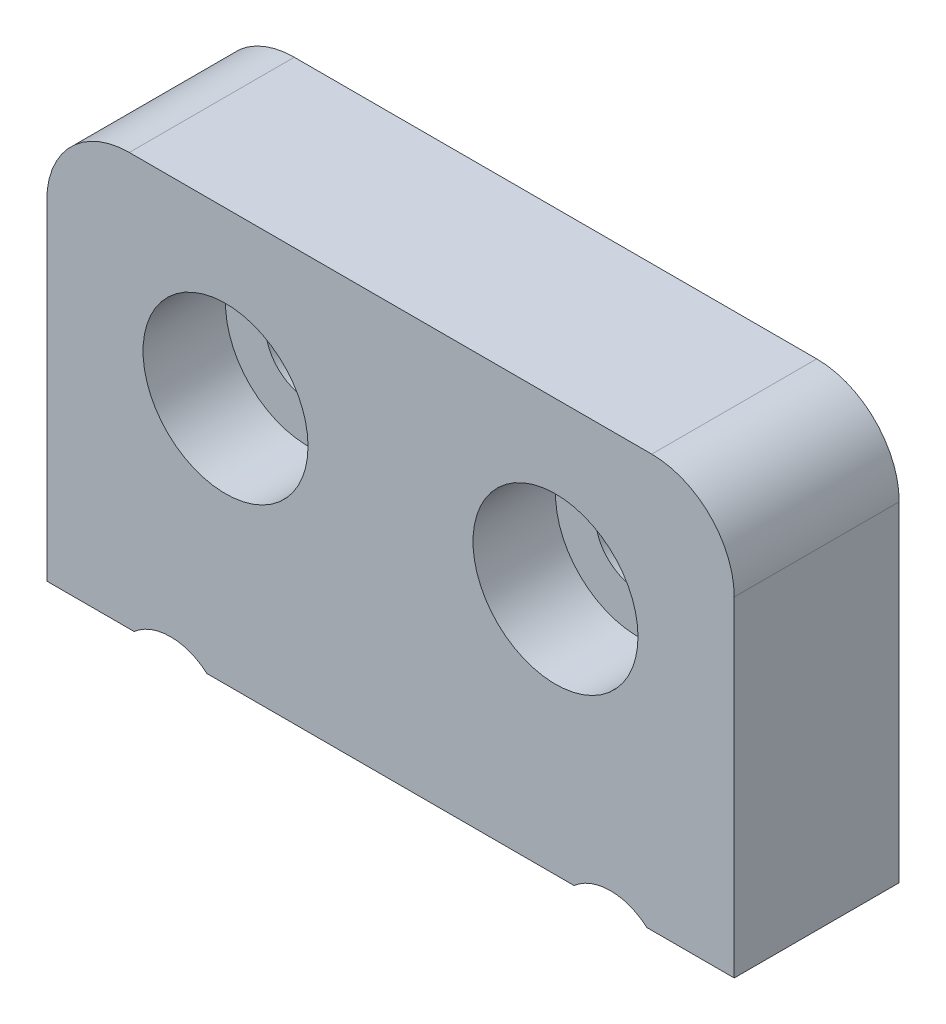
ISO-10303-21;
HEADER;
FILE_DESCRIPTION(('STEP AP214'),'2;1');
FILE_NAME('part.step','',(''),(''),'','','');
FILE_SCHEMA(('AUTOMOTIVE_DESIGN { 1 0 10303 214 1 1 1 1 }'));
ENDSEC;
DATA;
#1=APPLICATION_CONTEXT('core data for automotive mechanical design processes');
#2=APPLICATION_PROTOCOL_DEFINITION('international standard','automotive_design',2000,#1);
#3=PRODUCT_CONTEXT('',#1,'mechanical');
#4=PRODUCT('Part','Part','',(#3));
#5=PRODUCT_RELATED_PRODUCT_CATEGORY('part','',(#4));
#6=PRODUCT_DEFINITION_FORMATION('','',#4);
#7=PRODUCT_DEFINITION_CONTEXT('part definition',#1,'design');
#8=PRODUCT_DEFINITION('design','',#6,#7);
#9=PRODUCT_DEFINITION_SHAPE('','',#8);
#10=(LENGTH_UNIT() NAMED_UNIT(*) SI_UNIT(.MILLI.,.METRE.));
#11=(NAMED_UNIT(*) PLANE_ANGLE_UNIT() SI_UNIT($,.RADIAN.));
#12=(NAMED_UNIT(*) SI_UNIT($,.STERADIAN.) SOLID_ANGLE_UNIT());
#13=UNCERTAINTY_MEASURE_WITH_UNIT(LENGTH_MEASURE(1.E-05),#10,'distance_accuracy_value','');
#14=(GEOMETRIC_REPRESENTATION_CONTEXT(3) GLOBAL_UNCERTAINTY_ASSIGNED_CONTEXT((#13)) GLOBAL_UNIT_ASSIGNED_CONTEXT((#10,
#11,#12)) REPRESENTATION_CONTEXT('',''));
#15=CARTESIAN_POINT('',(0.,0.,0.));
#16=DIRECTION('',(0.,0.,1.));
#17=DIRECTION('',(1.,0.,0.));
#18=AXIS2_PLACEMENT_3D('',#15,#16,#17);
#19=CARTESIAN_POINT('',(6.5,9.,6.));
#20=DIRECTION('',(0.,0.,-1.));
#21=DIRECTION('',(-1.,0.,0.));
#22=AXIS2_PLACEMENT_3D('',#19,#20,#21);
#23=CYLINDRICAL_SURFACE('',#22,1.55);
#24=CARTESIAN_POINT('',(6.5,9.,0.));
#25=DIRECTION('',(0.,0.,1.));
#26=DIRECTION('',(1.,0.,0.));
#27=AXIS2_PLACEMENT_3D('',#24,#25,#26);
#28=CIRCLE('',#27,1.55);
#29=CARTESIAN_POINT('',(8.05,9.,0.));
#30=VERTEX_POINT('',#29);
#31=EDGE_CURVE('E194',#30,#30,#28,.T.);
#32=ORIENTED_EDGE('',*,*,#31,.F.);
#33=EDGE_LOOP('',(#32));
#34=FACE_BOUND('',#33,.T.);
#35=CARTESIAN_POINT('',(6.5,9.,3.));
#36=DIRECTION('',(0.,0.,1.));
#37=DIRECTION('',(1.,0.,0.));
#38=AXIS2_PLACEMENT_3D('',#35,#36,#37);
#39=CIRCLE('',#38,1.55);
#40=CARTESIAN_POINT('',(8.05,9.,3.));
#41=VERTEX_POINT('',#40);
#42=EDGE_CURVE('E43',#41,#41,#39,.T.);
#43=ORIENTED_EDGE('',*,*,#42,.T.);
#44=EDGE_LOOP('',(#43));
#45=FACE_BOUND('',#44,.T.);
#46=ADVANCED_FACE('F39',(#34,#45),#23,.F.);
#47=CARTESIAN_POINT('',(18.5,9.,6.));
#48=DIRECTION('',(0.,0.,-1.));
#49=DIRECTION('',(-1.,0.,0.));
#50=AXIS2_PLACEMENT_3D('',#47,#48,#49);
#51=CYLINDRICAL_SURFACE('',#50,1.55);
#52=CARTESIAN_POINT('',(18.5,9.,0.));
#53=DIRECTION('',(0.,0.,1.));
#54=DIRECTION('',(-1.,0.,0.));
#55=AXIS2_PLACEMENT_3D('',#52,#53,#54);
#56=CIRCLE('',#55,1.55);
#57=CARTESIAN_POINT('',(16.95,9.,0.));
#58=VERTEX_POINT('',#57);
#59=EDGE_CURVE('E199',#58,#58,#56,.T.);
#60=ORIENTED_EDGE('',*,*,#59,.F.);
#61=EDGE_LOOP('',(#60));
#62=FACE_BOUND('',#61,.T.);
#63=CARTESIAN_POINT('',(18.5,9.,3.));
#64=DIRECTION('',(0.,0.,1.));
#65=DIRECTION('',(1.,0.,0.));
#66=AXIS2_PLACEMENT_3D('',#63,#64,#65);
#67=CIRCLE('',#66,1.55);
#68=CARTESIAN_POINT('',(20.05,9.,3.));
#69=VERTEX_POINT('',#68);
#70=EDGE_CURVE('E274',#69,#69,#67,.T.);
#71=ORIENTED_EDGE('',*,*,#70,.T.);
#72=EDGE_LOOP('',(#71));
#73=FACE_BOUND('',#72,.T.);
#74=ADVANCED_FACE('F391',(#62,#73),#51,.F.);
#75=CARTESIAN_POINT('',(0.,0.,6.));
#76=DIRECTION('',(0.,1.,0.));
#77=DIRECTION('',(0.,0.,1.));
#78=AXIS2_PLACEMENT_3D('',#75,#76,#77);
#79=PLANE('',#78);
#80=DIRECTION('',(1.,0.,0.));
#81=VECTOR('',#80,1.);
#82=CARTESIAN_POINT('',(0.,0.,0.));
#83=LINE('',#82,#81);
#84=CARTESIAN_POINT('',(0.,0.,0.));
#85=VERTEX_POINT('',#84);
#86=CARTESIAN_POINT('',(3.17712434446771,0.,0.));
#87=VERTEX_POINT('',#86);
#88=EDGE_CURVE('E165',#85,#87,#83,.T.);
#89=ORIENTED_EDGE('',*,*,#88,.T.);
#90=DIRECTION('',(0.,0.,1.));
#91=VECTOR('',#90,1.);
#92=CARTESIAN_POINT('',(3.17712434446771,0.,0.));
#93=LINE('',#92,#91);
#94=CARTESIAN_POINT('',(3.17712434446771,0.,2.29289321881345));
#95=VERTEX_POINT('',#94);
#96=EDGE_CURVE('E144',#87,#95,#93,.T.);
#97=ORIENTED_EDGE('',*,*,#96,.T.);
#98=CARTESIAN_POINT('',(4.5,0.,3.));
#99=DIRECTION('',(0.,-1.,0.));
#100=DIRECTION('',(0.,0.,-1.));
#101=AXIS2_PLACEMENT_3D('',#98,#99,#100);
#102=CIRCLE('',#101,1.5);
#103=CARTESIAN_POINT('',(3.17712434446771,0.,3.70710678118655));
#104=VERTEX_POINT('',#103);
#105=EDGE_CURVE('E231',#104,#95,#102,.T.);
#106=ORIENTED_EDGE('',*,*,#105,.F.);
#107=CARTESIAN_POINT('',(3.17712434446771,0.,6.));
#108=VERTEX_POINT('',#107);
#109=EDGE_CURVE('E157',#104,#108,#93,.T.);
#110=ORIENTED_EDGE('',*,*,#109,.T.);
#111=DIRECTION('',(1.,0.,0.));
#112=VECTOR('',#111,1.);
#113=CARTESIAN_POINT('',(0.,0.,6.));
#114=LINE('',#113,#112);
#115=CARTESIAN_POINT('',(0.,0.,6.));
#116=VERTEX_POINT('',#115);
#117=EDGE_CURVE('E209',#116,#108,#114,.T.);
#118=ORIENTED_EDGE('',*,*,#117,.F.);
#119=DIRECTION('',(0.,0.,-1.));
#120=VECTOR('',#119,1.);
#121=CARTESIAN_POINT('',(0.,0.,6.));
#122=LINE('',#121,#120);
#123=EDGE_CURVE('E176',#116,#85,#122,.T.);
#124=ORIENTED_EDGE('',*,*,#123,.T.);
#125=EDGE_LOOP('',(#89,#97,#106,#110,#118,#124));
#126=FACE_BOUND('',#125,.T.);
#127=ADVANCED_FACE('F173',(#126),#79,.F.);
#128=CARTESIAN_POINT('',(5.8228756555323,0.,6.));
#129=VERTEX_POINT('',#128);
#130=CARTESIAN_POINT('',(19.1771243444677,0.,6.));
#131=VERTEX_POINT('',#130);
#132=EDGE_CURVE('E213',#129,#131,#114,.T.);
#133=ORIENTED_EDGE('',*,*,#132,.F.);
#134=DIRECTION('',(0.,0.,1.));
#135=VECTOR('',#134,1.);
#136=CARTESIAN_POINT('',(5.8228756555323,0.,0.));
#137=LINE('',#136,#135);
#138=CARTESIAN_POINT('',(5.8228756555323,0.,3.70710678118655));
#139=VERTEX_POINT('',#138);
#140=EDGE_CURVE('E156',#139,#129,#137,.T.);
#141=ORIENTED_EDGE('',*,*,#140,.F.);
#142=CARTESIAN_POINT('',(5.8228756555323,0.,2.29289321881345));
#143=VERTEX_POINT('',#142);
#144=EDGE_CURVE('E232',#143,#139,#102,.T.);
#145=ORIENTED_EDGE('',*,*,#144,.F.);
#146=CARTESIAN_POINT('',(5.8228756555323,0.,0.));
#147=VERTEX_POINT('',#146);
#148=EDGE_CURVE('E254',#147,#143,#137,.T.);
#149=ORIENTED_EDGE('',*,*,#148,.F.);
#150=CARTESIAN_POINT('',(19.1771243444677,0.,0.));
#151=VERTEX_POINT('',#150);
#152=EDGE_CURVE('E169',#147,#151,#83,.T.);
#153=ORIENTED_EDGE('',*,*,#152,.T.);
#154=DIRECTION('',(0.,0.,1.));
#155=VECTOR('',#154,1.);
#156=CARTESIAN_POINT('',(19.1771243444677,0.,0.));
#157=LINE('',#156,#155);
#158=CARTESIAN_POINT('',(19.1771243444677,0.,2.29289321881345));
#159=VERTEX_POINT('',#158);
#160=EDGE_CURVE('E239',#151,#159,#157,.T.);
#161=ORIENTED_EDGE('',*,*,#160,.T.);
#162=CARTESIAN_POINT('',(20.5,0.,3.));
#163=DIRECTION('',(0.,-1.,0.));
#164=DIRECTION('',(0.,0.,1.));
#165=AXIS2_PLACEMENT_3D('',#162,#163,#164);
#166=CIRCLE('',#165,1.5);
#167=CARTESIAN_POINT('',(19.1771243444677,0.,3.70710678118655));
#168=VERTEX_POINT('',#167);
#169=EDGE_CURVE('E222',#168,#159,#166,.T.);
#170=ORIENTED_EDGE('',*,*,#169,.F.);
#171=EDGE_CURVE('E244',#168,#131,#157,.T.);
#172=ORIENTED_EDGE('',*,*,#171,.T.);
#173=EDGE_LOOP('',(#133,#141,#145,#149,#153,#161,#170,#172));
#174=FACE_BOUND('',#173,.T.);
#175=ADVANCED_FACE('F388',(#174),#79,.F.);
#176=CARTESIAN_POINT('',(0.,0.,6.));
#177=DIRECTION('',(0.,0.,-1.));
#178=DIRECTION('',(-1.,0.,0.));
#179=AXIS2_PLACEMENT_3D('',#176,#177,#178);
#180=PLANE('',#179);
#181=CARTESIAN_POINT('',(6.5,9.,6.));
#182=DIRECTION('',(0.,0.,1.));
#183=DIRECTION('',(1.,0.,0.));
#184=AXIS2_PLACEMENT_3D('',#181,#182,#183);
#185=CIRCLE('',#184,3.);
#186=CARTESIAN_POINT('',(9.5,9.,6.));
#187=VERTEX_POINT('',#186);
#188=EDGE_CURVE('E267',#187,#187,#185,.T.);
#189=ORIENTED_EDGE('',*,*,#188,.F.);
#190=EDGE_LOOP('',(#189));
#191=FACE_BOUND('',#190,.T.);
#192=CARTESIAN_POINT('',(18.5,9.,6.));
#193=DIRECTION('',(0.,0.,1.));
#194=DIRECTION('',(1.,0.,0.));
#195=AXIS2_PLACEMENT_3D('',#192,#193,#194);
#196=CIRCLE('',#195,3.);
#197=CARTESIAN_POINT('',(21.5,9.,6.));
#198=VERTEX_POINT('',#197);
#199=EDGE_CURVE('E259',#198,#198,#196,.T.);
#200=ORIENTED_EDGE('',*,*,#199,.F.);
#201=EDGE_LOOP('',(#200));
#202=FACE_BOUND('',#201,.T.);
#203=DIRECTION('',(-1.,0.,0.));
#204=VECTOR('',#203,1.);
#205=CARTESIAN_POINT('',(0.,15.,6.));
#206=LINE('',#205,#204);
#207=CARTESIAN_POINT('',(22.,15.,6.));
#208=VERTEX_POINT('',#207);
#209=CARTESIAN_POINT('',(3.,15.,6.));
#210=VERTEX_POINT('',#209);
#211=EDGE_CURVE('E202',#208,#210,#206,.T.);
#212=ORIENTED_EDGE('',*,*,#211,.T.);
#213=CARTESIAN_POINT('',(3.,12.,6.));
#214=DIRECTION('',(0.,0.,-1.));
#215=DIRECTION('',(-1.,0.,0.));
#216=AXIS2_PLACEMENT_3D('',#213,#214,#215);
#217=CIRCLE('',#216,3.);
#218=CARTESIAN_POINT('',(0.,12.,6.));
#219=VERTEX_POINT('',#218);
#220=EDGE_CURVE('E49',#210,#219,#217,.F.);
#221=ORIENTED_EDGE('',*,*,#220,.T.);
#222=DIRECTION('',(0.,-1.,0.));
#223=VECTOR('',#222,1.);
#224=CARTESIAN_POINT('',(0.,0.,6.));
#225=LINE('',#224,#223);
#226=EDGE_CURVE('E215',#219,#116,#225,.T.);
#227=ORIENTED_EDGE('',*,*,#226,.T.);
#228=ORIENTED_EDGE('',*,*,#117,.T.);
#229=CARTESIAN_POINT('',(4.5,-1.5,6.));
#230=DIRECTION('',(0.,0.,1.));
#231=DIRECTION('',(-1.,0.,0.));
#232=AXIS2_PLACEMENT_3D('',#229,#230,#231);
#233=CIRCLE('',#232,2.);
#234=EDGE_CURVE('E171',#129,#108,#233,.T.);
#235=ORIENTED_EDGE('',*,*,#234,.F.);
#236=ORIENTED_EDGE('',*,*,#132,.T.);
#237=CARTESIAN_POINT('',(20.5,-1.49999999999999,6.));
#238=DIRECTION('',(0.,0.,1.));
#239=DIRECTION('',(1.,0.,0.));
#240=AXIS2_PLACEMENT_3D('',#237,#238,#239);
#241=CIRCLE('',#240,2.);
#242=CARTESIAN_POINT('',(21.8228756555323,0.,6.));
#243=VERTEX_POINT('',#242);
#244=EDGE_CURVE('E248',#243,#131,#241,.T.);
#245=ORIENTED_EDGE('',*,*,#244,.F.);
#246=CARTESIAN_POINT('',(25.,0.,6.));
#247=VERTEX_POINT('',#246);
#248=EDGE_CURVE('E214',#243,#247,#114,.T.);
#249=ORIENTED_EDGE('',*,*,#248,.T.);
#250=DIRECTION('',(0.,1.,0.));
#251=VECTOR('',#250,1.);
#252=CARTESIAN_POINT('',(25.,0.,6.));
#253=LINE('',#252,#251);
#254=CARTESIAN_POINT('',(25.,12.,6.));
#255=VERTEX_POINT('',#254);
#256=EDGE_CURVE('E206',#247,#255,#253,.T.);
#257=ORIENTED_EDGE('',*,*,#256,.T.);
#258=CARTESIAN_POINT('',(22.,12.,6.));
#259=DIRECTION('',(0.,0.,-1.));
#260=DIRECTION('',(-1.,0.,0.));
#261=AXIS2_PLACEMENT_3D('',#258,#259,#260);
#262=CIRCLE('',#261,3.);
#263=EDGE_CURVE('E286',#255,#208,#262,.F.);
#264=ORIENTED_EDGE('',*,*,#263,.T.);
#265=EDGE_LOOP('',(#212,#221,#227,#228,#235,#236,#245,#249,#257,#264));
#266=FACE_BOUND('',#265,.T.);
#267=ADVANCED_FACE('F377',(#191,#202,#266),#180,.F.);
#268=CARTESIAN_POINT('',(0.,0.,0.));
#269=DIRECTION('',(0.,0.,-1.));
#270=DIRECTION('',(-1.,0.,0.));
#271=AXIS2_PLACEMENT_3D('',#268,#269,#270);
#272=PLANE('',#271);
#273=DIRECTION('',(0.,-1.,0.));
#274=VECTOR('',#273,1.);
#275=CARTESIAN_POINT('',(0.,0.,0.));
#276=LINE('',#275,#274);
#277=CARTESIAN_POINT('',(0.,12.,0.));
#278=VERTEX_POINT('',#277);
#279=EDGE_CURVE('E187',#278,#85,#276,.T.);
#280=ORIENTED_EDGE('',*,*,#279,.F.);
#281=CARTESIAN_POINT('',(3.,12.,0.));
#282=DIRECTION('',(0.,0.,-1.));
#283=DIRECTION('',(-1.,0.,0.));
#284=AXIS2_PLACEMENT_3D('',#281,#282,#283);
#285=CIRCLE('',#284,3.);
#286=CARTESIAN_POINT('',(3.,15.,0.));
#287=VERTEX_POINT('',#286);
#288=EDGE_CURVE('E295',#278,#287,#285,.T.);
#289=ORIENTED_EDGE('',*,*,#288,.T.);
#290=DIRECTION('',(-1.,0.,0.));
#291=VECTOR('',#290,1.);
#292=CARTESIAN_POINT('',(0.,15.,0.));
#293=LINE('',#292,#291);
#294=CARTESIAN_POINT('',(22.,15.,0.));
#295=VERTEX_POINT('',#294);
#296=EDGE_CURVE('E183',#295,#287,#293,.T.);
#297=ORIENTED_EDGE('',*,*,#296,.F.);
#298=CARTESIAN_POINT('',(22.,12.,0.));
#299=DIRECTION('',(0.,0.,-1.));
#300=DIRECTION('',(-1.,0.,0.));
#301=AXIS2_PLACEMENT_3D('',#298,#299,#300);
#302=CIRCLE('',#301,3.);
#303=CARTESIAN_POINT('',(25.,12.,0.));
#304=VERTEX_POINT('',#303);
#305=EDGE_CURVE('E298',#295,#304,#302,.T.);
#306=ORIENTED_EDGE('',*,*,#305,.T.);
#307=DIRECTION('',(0.,1.,0.));
#308=VECTOR('',#307,1.);
#309=CARTESIAN_POINT('',(25.,0.,0.));
#310=LINE('',#309,#308);
#311=CARTESIAN_POINT('',(25.,0.,0.));
#312=VERTEX_POINT('',#311);
#313=EDGE_CURVE('E178',#312,#304,#310,.T.);
#314=ORIENTED_EDGE('',*,*,#313,.F.);
#315=CARTESIAN_POINT('',(21.8228756555323,0.,0.));
#316=VERTEX_POINT('',#315);
#317=EDGE_CURVE('E180',#316,#312,#83,.T.);
#318=ORIENTED_EDGE('',*,*,#317,.F.);
#319=CARTESIAN_POINT('',(20.5,-1.49999999999999,0.));
#320=DIRECTION('',(0.,0.,1.));
#321=DIRECTION('',(1.,0.,0.));
#322=AXIS2_PLACEMENT_3D('',#319,#320,#321);
#323=CIRCLE('',#322,2.);
#324=EDGE_CURVE('E251',#316,#151,#323,.T.);
#325=ORIENTED_EDGE('',*,*,#324,.T.);
#326=ORIENTED_EDGE('',*,*,#152,.F.);
#327=CARTESIAN_POINT('',(4.5,-1.5,0.));
#328=DIRECTION('',(0.,0.,1.));
#329=DIRECTION('',(-1.,0.,0.));
#330=AXIS2_PLACEMENT_3D('',#327,#328,#329);
#331=CIRCLE('',#330,2.);
#332=EDGE_CURVE('E147',#147,#87,#331,.T.);
#333=ORIENTED_EDGE('',*,*,#332,.T.);
#334=ORIENTED_EDGE('',*,*,#88,.F.);
#335=EDGE_LOOP('',(#280,#289,#297,#306,#314,#318,#325,#326,#333,#334));
#336=FACE_BOUND('',#335,.T.);
#337=ORIENTED_EDGE('',*,*,#31,.T.);
#338=EDGE_LOOP('',(#337));
#339=FACE_BOUND('',#338,.T.);
#340=ORIENTED_EDGE('',*,*,#59,.T.);
#341=EDGE_LOOP('',(#340));
#342=FACE_BOUND('',#341,.T.);
#343=ADVANCED_FACE('F163',(#336,#339,#342),#272,.T.);
#344=CARTESIAN_POINT('',(0.,0.,6.));
#345=DIRECTION('',(1.,0.,0.));
#346=DIRECTION('',(0.,1.,0.));
#347=AXIS2_PLACEMENT_3D('',#344,#345,#346);
#348=PLANE('',#347);
#349=ORIENTED_EDGE('',*,*,#226,.F.);
#350=DIRECTION('',(0.,0.,-1.));
#351=VECTOR('',#350,1.);
#352=CARTESIAN_POINT('',(0.,12.,6.));
#353=LINE('',#352,#351);
#354=EDGE_CURVE('E301',#219,#278,#353,.T.);
#355=ORIENTED_EDGE('',*,*,#354,.T.);
#356=ORIENTED_EDGE('',*,*,#279,.T.);
#357=ORIENTED_EDGE('',*,*,#123,.F.);
#358=EDGE_LOOP('',(#349,#355,#356,#357));
#359=FACE_BOUND('',#358,.T.);
#360=ADVANCED_FACE('F378',(#359),#348,.F.);
#361=ORIENTED_EDGE('',*,*,#248,.F.);
#362=DIRECTION('',(0.,0.,1.));
#363=VECTOR('',#362,1.);
#364=CARTESIAN_POINT('',(21.8228756555323,0.,0.));
#365=LINE('',#364,#363);
#366=CARTESIAN_POINT('',(21.8228756555323,0.,3.70710678118656));
#367=VERTEX_POINT('',#366);
#368=EDGE_CURVE('E243',#367,#243,#365,.T.);
#369=ORIENTED_EDGE('',*,*,#368,.F.);
#370=CARTESIAN_POINT('',(21.8228756555323,0.,2.29289321881345));
#371=VERTEX_POINT('',#370);
#372=EDGE_CURVE('E227',#371,#367,#166,.T.);
#373=ORIENTED_EDGE('',*,*,#372,.F.);
#374=EDGE_CURVE('E245',#316,#371,#365,.T.);
#375=ORIENTED_EDGE('',*,*,#374,.F.);
#376=ORIENTED_EDGE('',*,*,#317,.T.);
#377=DIRECTION('',(0.,0.,-1.));
#378=VECTOR('',#377,1.);
#379=CARTESIAN_POINT('',(25.,0.,6.));
#380=LINE('',#379,#378);
#381=EDGE_CURVE('E205',#247,#312,#380,.T.);
#382=ORIENTED_EDGE('',*,*,#381,.F.);
#383=EDGE_LOOP('',(#361,#369,#373,#375,#376,#382));
#384=FACE_BOUND('',#383,.T.);
#385=ADVANCED_FACE('F380',(#384),#79,.F.);
#386=CARTESIAN_POINT('',(25.,0.,6.));
#387=DIRECTION('',(-1.,0.,0.));
#388=DIRECTION('',(0.,0.,1.));
#389=AXIS2_PLACEMENT_3D('',#386,#387,#388);
#390=PLANE('',#389);
#391=ORIENTED_EDGE('',*,*,#313,.T.);
#392=DIRECTION('',(0.,0.,-1.));
#393=VECTOR('',#392,1.);
#394=CARTESIAN_POINT('',(25.,12.,6.));
#395=LINE('',#394,#393);
#396=EDGE_CURVE('E11',#304,#255,#395,.F.);
#397=ORIENTED_EDGE('',*,*,#396,.T.);
#398=ORIENTED_EDGE('',*,*,#256,.F.);
#399=ORIENTED_EDGE('',*,*,#381,.T.);
#400=EDGE_LOOP('',(#391,#397,#398,#399));
#401=FACE_BOUND('',#400,.T.);
#402=ADVANCED_FACE('F386',(#401),#390,.F.);
#403=CARTESIAN_POINT('',(0.,15.,6.));
#404=DIRECTION('',(0.,-1.,0.));
#405=DIRECTION('',(1.,0.,0.));
#406=AXIS2_PLACEMENT_3D('',#403,#404,#405);
#407=PLANE('',#406);
#408=ORIENTED_EDGE('',*,*,#296,.T.);
#409=DIRECTION('',(0.,0.,-1.));
#410=VECTOR('',#409,1.);
#411=CARTESIAN_POINT('',(3.,15.,6.));
#412=LINE('',#411,#410);
#413=EDGE_CURVE('E63',#287,#210,#412,.F.);
#414=ORIENTED_EDGE('',*,*,#413,.T.);
#415=ORIENTED_EDGE('',*,*,#211,.F.);
#416=DIRECTION('',(0.,0.,-1.));
#417=VECTOR('',#416,1.);
#418=CARTESIAN_POINT('',(22.,15.,6.));
#419=LINE('',#418,#417);
#420=EDGE_CURVE('E291',#208,#295,#419,.T.);
#421=ORIENTED_EDGE('',*,*,#420,.T.);
#422=EDGE_LOOP('',(#408,#414,#415,#421));
#423=FACE_BOUND('',#422,.T.);
#424=ADVANCED_FACE('F370',(#423),#407,.F.);
#425=CARTESIAN_POINT('',(20.5,6.,3.));
#426=DIRECTION('',(0.,-1.,0.));
#427=DIRECTION('',(0.,0.,-1.));
#428=AXIS2_PLACEMENT_3D('',#425,#426,#427);
#429=CYLINDRICAL_SURFACE('',#428,1.5);
#430=CARTESIAN_POINT('',(20.5,6.,3.));
#431=DIRECTION('',(0.,-1.,0.));
#432=DIRECTION('',(0.,0.,1.));
#433=AXIS2_PLACEMENT_3D('',#430,#431,#432);
#434=CIRCLE('',#433,1.5);
#435=CARTESIAN_POINT('',(20.5,6.,4.5));
#436=VERTEX_POINT('',#435);
#437=EDGE_CURVE('E226',#436,#436,#434,.T.);
#438=ORIENTED_EDGE('',*,*,#437,.F.);
#439=EDGE_LOOP('',(#438));
#440=FACE_BOUND('',#439,.T.);
#441=ORIENTED_EDGE('',*,*,#372,.T.);
#442=CARTESIAN_POINT('',(21.8228756555323,0.,3.70710678118654));
#443=CARTESIAN_POINT('',(21.8014919562272,0.0188676180352534,3.74708682330958));
#444=CARTESIAN_POINT('',(21.7784493231782,0.0383679371376474,3.7858592704165));
#445=CARTESIAN_POINT('',(21.7291462172079,0.0780345729919214,3.86094509158992));
#446=CARTESIAN_POINT('',(21.7028855964205,0.0982009203165721,3.89725835253808));
#447=CARTESIAN_POINT('',(21.6469669649219,0.138802802245405,3.96773308969078));
#448=CARTESIAN_POINT('',(21.6172772581156,0.159238995507699,4.00186906682901));
#449=CARTESIAN_POINT('',(21.554796122708,0.199644335418337,4.06745382459889));
#450=CARTESIAN_POINT('',(21.522004677248,0.219613479527433,4.0989025906232));
#451=CARTESIAN_POINT('',(21.4188974142062,0.278165440756987,4.1891083848586));
#452=CARTESIAN_POINT('',(21.3439235474569,0.315335914558865,4.24363000682422));
#453=CARTESIAN_POINT('',(21.1829030473028,0.381798247168387,4.33877218966839));
#454=CARTESIAN_POINT('',(21.0969132508465,0.411128314922483,4.3794604393817));
#455=CARTESIAN_POINT('',(20.9422926484404,0.451613512373413,4.43493475305081));
#456=CARTESIAN_POINT('',(20.8758552647063,0.465572564129989,4.45381026992966));
#457=CARTESIAN_POINT('',(20.7399525282736,0.486740780185251,4.48230634361631));
#458=CARTESIAN_POINT('',(20.6704880798369,0.493951945979899,4.49192964475463));
#459=CARTESIAN_POINT('',(20.530356291928,0.501002567332316,4.50133973226743));
#460=CARTESIAN_POINT('',(20.4596865799253,0.500825252690772,4.5011041411547));
#461=CARTESIAN_POINT('',(20.3194891612669,0.493074676878126,4.49075759484679));
#462=CARTESIAN_POINT('',(20.2499616160731,0.485500379030052,4.48064525543896));
#463=CARTESIAN_POINT('',(20.1162593736178,0.463971577181141,4.45164547152622));
#464=CARTESIAN_POINT('',(20.0519841108916,0.450232731264019,4.43305431225438));
#465=CARTESIAN_POINT('',(19.9276842184509,0.417443998296927,4.38810206113946));
#466=CARTESIAN_POINT('',(19.8676601860252,0.398393366801204,4.36173988015949));
#467=CARTESIAN_POINT('',(19.7463862636162,0.353829680879837,4.29893362913803));
#468=CARTESIAN_POINT('',(19.6857239914186,0.32783700160323,4.2617009072017));
#469=CARTESIAN_POINT('',(19.5712084448037,0.272401254079498,4.17996153847462));
#470=CARTESIAN_POINT('',(19.5173650605316,0.242953290796779,4.13544453610605));
#471=CARTESIAN_POINT('',(19.4088143646571,0.177478290213936,4.03236318645604));
#472=CARTESIAN_POINT('',(19.3553326980773,0.141149961849558,3.97269075824824));
#473=CARTESIAN_POINT('',(19.2827132507006,0.0871747598062475,3.87738437095517));
#474=CARTESIAN_POINT('',(19.2597966384637,0.0692901495259222,3.84469148563836));
#475=CARTESIAN_POINT('',(19.2165251139461,0.0341028505127447,3.77735910087809));
#476=CARTESIAN_POINT('',(19.1961701186795,0.0168001429419566,3.74271966454749));
#477=CARTESIAN_POINT('',(19.1771243444677,0.,3.70710678118655));
#478=B_SPLINE_CURVE_WITH_KNOTS('',3,(#442,#443,#444,#445,#446,#447,#448,#449,#450,#451,#452,
#453,#454,#455,#456,#457,#458,#459,#460,#461,#462,#463,#464,#465,#466,#467,#468,#469,#470,#471,
#472,#473,#474,#475,#476,#477),.UNSPECIFIED.,.F.,.F.,(4,2,2,2,2,2,2,2,2,2,2,2,2,2,2,2,2,4),(0.,
0.147252939966639,0.294512648722571,0.443262829972709,0.592013819758455,0.889911528678035,
1.18632986126123,1.39682529236933,1.60725826844703,1.81816890631166,2.02910910725317,
2.23318451248136,2.43728853322801,2.66377865896504,2.89059361367677,3.15349717681631,
3.28463821689537,3.415775007451),.UNSPECIFIED.);
#479=EDGE_CURVE('E304',#367,#168,#478,.T.);
#480=ORIENTED_EDGE('',*,*,#479,.T.);
#481=ORIENTED_EDGE('',*,*,#169,.T.);
#482=CARTESIAN_POINT('',(19.1771243444677,0.,2.29289321881347));
#483=CARTESIAN_POINT('',(19.1985080437728,0.0188676180352529,2.25291317669042));
#484=CARTESIAN_POINT('',(19.2215506768218,0.0383679371376468,2.21414072958351));
#485=CARTESIAN_POINT('',(19.2708537827921,0.078034572991921,2.13905490841008));
#486=CARTESIAN_POINT('',(19.2971144035795,0.0982009203165723,2.10274164746192));
#487=CARTESIAN_POINT('',(19.3530330350781,0.138802802245406,2.03226691030923));
#488=CARTESIAN_POINT('',(19.3827227418844,0.159238995507699,1.99813093317099));
#489=CARTESIAN_POINT('',(19.445203877292,0.199644335418337,1.93254617540111));
#490=CARTESIAN_POINT('',(19.477995322752,0.219613479527433,1.90109740937681));
#491=CARTESIAN_POINT('',(19.5811025857938,0.278165440756988,1.8108916151414));
#492=CARTESIAN_POINT('',(19.6560764525431,0.315335914558865,1.75636999317578));
#493=CARTESIAN_POINT('',(19.8170969526973,0.381798247168387,1.66122781033161));
#494=CARTESIAN_POINT('',(19.9030867491535,0.411128314922484,1.62053956061831));
#495=CARTESIAN_POINT('',(20.0577073515596,0.451613512373415,1.56506524694919));
#496=CARTESIAN_POINT('',(20.1241447352937,0.46557256412999,1.54618973007034));
#497=CARTESIAN_POINT('',(20.2600474717264,0.486740780185252,1.5176936563837));
#498=CARTESIAN_POINT('',(20.3295119201631,0.493951945979899,1.50807035524537));
#499=CARTESIAN_POINT('',(20.469643708072,0.501002567332316,1.49866026773257));
#500=CARTESIAN_POINT('',(20.5403134200747,0.500825252690772,1.49889585884531));
#501=CARTESIAN_POINT('',(20.6805108387331,0.493074676878125,1.50924240515322));
#502=CARTESIAN_POINT('',(20.7500383839269,0.485500379030051,1.51935474456104));
#503=CARTESIAN_POINT('',(20.8837406263822,0.46397157718114,1.54835452847378));
#504=CARTESIAN_POINT('',(20.9480158891084,0.450232731264018,1.56694568774563));
#505=CARTESIAN_POINT('',(21.0723157815491,0.417443998296926,1.61189793886055));
#506=CARTESIAN_POINT('',(21.1323398139748,0.398393366801202,1.63826011984052));
#507=CARTESIAN_POINT('',(21.2536137363838,0.353829680879834,1.70106637086198));
#508=CARTESIAN_POINT('',(21.3142760085814,0.327837001603227,1.73829909279831));
#509=CARTESIAN_POINT('',(21.4287915551963,0.272401254079496,1.82003846152539));
#510=CARTESIAN_POINT('',(21.4826349394684,0.242953290796776,1.86455546389396));
#511=CARTESIAN_POINT('',(21.5911856353429,0.177478290213934,1.96763681354397));
#512=CARTESIAN_POINT('',(21.6446673019227,0.141149961849557,2.02730924175176));
#513=CARTESIAN_POINT('',(21.7172867492994,0.0871747598062484,2.12261562904483));
#514=CARTESIAN_POINT('',(21.7402033615363,0.0692901495259237,2.15530851436164));
#515=CARTESIAN_POINT('',(21.7834748860539,0.0341028505127469,2.2226408991219));
#516=CARTESIAN_POINT('',(21.8038298813204,0.016800142941959,2.25728033545251));
#517=CARTESIAN_POINT('',(21.8228756555323,0.,2.29289321881345));
#518=B_SPLINE_CURVE_WITH_KNOTS('',3,(#482,#483,#484,#485,#486,#487,#488,#489,#490,#491,#492,
#493,#494,#495,#496,#497,#498,#499,#500,#501,#502,#503,#504,#505,#506,#507,#508,#509,#510,#511,
#512,#513,#514,#515,#516,#517),.UNSPECIFIED.,.F.,.F.,(4,2,2,2,2,2,2,2,2,2,2,2,2,2,2,2,2,4),(0.,
0.147252939966638,0.294512648722572,0.44326282997271,0.592013819758455,0.889911528678035,
1.18632986126123,1.39682529236934,1.60725826844704,1.81816890631166,2.02910910725317,
2.23318451248137,2.43728853322801,2.66377865896505,2.89059361367678,3.15349717681631,
3.28463821689537,3.41577500745099),.UNSPECIFIED.);
#519=EDGE_CURVE('E314',#159,#371,#518,.T.);
#520=ORIENTED_EDGE('',*,*,#519,.T.);
#521=EDGE_LOOP('',(#441,#480,#481,#520));
#522=FACE_BOUND('',#521,.T.);
#523=ADVANCED_FACE('F320',(#440,#522),#429,.F.);
#524=CARTESIAN_POINT('',(20.5,6.,3.));
#525=DIRECTION('',(0.,1.,0.));
#526=DIRECTION('',(0.,0.,1.));
#527=AXIS2_PLACEMENT_3D('',#524,#525,#526);
#528=PLANE('',#527);
#529=ORIENTED_EDGE('',*,*,#437,.T.);
#530=EDGE_LOOP('',(#529));
#531=FACE_BOUND('',#530,.T.);
#532=ADVANCED_FACE('F343',(#531),#528,.F.);
#533=CARTESIAN_POINT('',(4.5,6.,3.));
#534=DIRECTION('',(0.,-1.,0.));
#535=DIRECTION('',(0.,0.,-1.));
#536=AXIS2_PLACEMENT_3D('',#533,#534,#535);
#537=CYLINDRICAL_SURFACE('',#536,1.5);
#538=CARTESIAN_POINT('',(4.5,6.,3.));
#539=DIRECTION('',(0.,-1.,0.));
#540=DIRECTION('',(0.,0.,-1.));
#541=AXIS2_PLACEMENT_3D('',#538,#539,#540);
#542=CIRCLE('',#541,1.5);
#543=CARTESIAN_POINT('',(4.5,6.,1.5));
#544=VERTEX_POINT('',#543);
#545=EDGE_CURVE('E221',#544,#544,#542,.T.);
#546=ORIENTED_EDGE('',*,*,#545,.F.);
#547=EDGE_LOOP('',(#546));
#548=FACE_BOUND('',#547,.T.);
#549=ORIENTED_EDGE('',*,*,#144,.T.);
#550=CARTESIAN_POINT('',(5.8228756555323,0.,3.70710678118655));
#551=CARTESIAN_POINT('',(5.80149195622719,0.0188676180352524,3.74708682330959));
#552=CARTESIAN_POINT('',(5.77844932317823,0.0383679371376462,3.78585927041651));
#553=CARTESIAN_POINT('',(5.72914621720791,0.0780345729919206,3.86094509158993));
#554=CARTESIAN_POINT('',(5.70288559642051,0.0982009203165719,3.89725835253809));
#555=CARTESIAN_POINT('',(5.64696696492187,0.138802802245405,3.96773308969079));
#556=CARTESIAN_POINT('',(5.61727725811557,0.159238995507698,4.00186906682902));
#557=CARTESIAN_POINT('',(5.55479612270795,0.199644335418335,4.0674538245989));
#558=CARTESIAN_POINT('',(5.52200467724803,0.219613479527431,4.0989025906232));
#559=CARTESIAN_POINT('',(5.41889741420616,0.278165440756985,4.18910838485861));
#560=CARTESIAN_POINT('',(5.34392354745686,0.315335914558862,4.24363000682422));
#561=CARTESIAN_POINT('',(5.18290304730274,0.381798247168384,4.3387721896684));
#562=CARTESIAN_POINT('',(5.09691325084652,0.411128314922479,4.3794604393817));
#563=CARTESIAN_POINT('',(4.94229264844037,0.451613512373408,4.43493475305082));
#564=CARTESIAN_POINT('',(4.87585526470631,0.465572564129982,4.45381026992966));
#565=CARTESIAN_POINT('',(4.73995252827357,0.486740780185243,4.48230634361631));
#566=CARTESIAN_POINT('',(4.67048807983692,0.49395194597989,4.49192964475463));
#567=CARTESIAN_POINT('',(4.53035629192797,0.501002567332307,4.50133973226743));
#568=CARTESIAN_POINT('',(4.45968657992524,0.500825252690762,4.50110414115469));
#569=CARTESIAN_POINT('',(4.31948916126684,0.493074676878115,4.49075759484678));
#570=CARTESIAN_POINT('',(4.24996161607308,0.485500379030041,4.48064525543896));
#571=CARTESIAN_POINT('',(4.11625937361779,0.463971577181129,4.45164547152622));
#572=CARTESIAN_POINT('',(4.05198411089163,0.450232731264007,4.43305431225437));
#573=CARTESIAN_POINT('',(3.92768421845088,0.417443998296914,4.38810206113945));
#574=CARTESIAN_POINT('',(3.86766018602518,0.398393366801191,4.36173988015948));
#575=CARTESIAN_POINT('',(3.74638626361622,0.353829680879823,4.29893362913802));
#576=CARTESIAN_POINT('',(3.68572399141858,0.327837001603215,4.26170090720169));
#577=CARTESIAN_POINT('',(3.57120844480374,0.272401254079483,4.17996153847461));
#578=CARTESIAN_POINT('',(3.51736506053164,0.242953290796764,4.13544453610603));
#579=CARTESIAN_POINT('',(3.40881436465713,0.177478290213923,4.03236318645603));
#580=CARTESIAN_POINT('',(3.35533269807729,0.141149961849546,3.97269075824823));
#581=CARTESIAN_POINT('',(3.28271325070059,0.0871747598062374,3.87738437095517));
#582=CARTESIAN_POINT('',(3.25979663846371,0.0692901495259127,3.84469148563835));
#583=CARTESIAN_POINT('',(3.2165251139461,0.034102850512736,3.77735910087809));
#584=CARTESIAN_POINT('',(3.19617011867955,0.0168001429419482,3.74271966454749));
#585=CARTESIAN_POINT('',(3.17712434446771,0.,3.70710678118655));
#586=B_SPLINE_CURVE_WITH_KNOTS('',3,(#550,#551,#552,#553,#554,#555,#556,#557,#558,#559,#560,
#561,#562,#563,#564,#565,#566,#567,#568,#569,#570,#571,#572,#573,#574,#575,#576,#577,#578,#579,
#580,#581,#582,#583,#584,#585),.UNSPECIFIED.,.F.,.F.,(4,2,2,2,2,2,2,2,2,2,2,2,2,2,2,2,2,4),(0.,
0.147252939966639,0.294512648722572,0.44326282997271,0.592013819758453,0.889911528678032,
1.18632986126123,1.39682529236933,1.60725826844703,1.81816890631166,2.02910910725316,
2.23318451248136,2.437288533228,2.66377865896504,2.89059361367677,3.1534971768163,
3.28463821689535,3.41577500745098),.UNSPECIFIED.);
#587=EDGE_CURVE('E352',#139,#104,#586,.T.);
#588=ORIENTED_EDGE('',*,*,#587,.T.);
#589=ORIENTED_EDGE('',*,*,#105,.T.);
#590=CARTESIAN_POINT('',(3.17712434446771,0.,2.29289321881345));
#591=CARTESIAN_POINT('',(3.19850804377281,0.0188676180352524,2.25291317669041));
#592=CARTESIAN_POINT('',(3.22155067682177,0.0383679371376462,2.21414072958349));
#593=CARTESIAN_POINT('',(3.27085378279209,0.0780345729919204,2.13905490841007));
#594=CARTESIAN_POINT('',(3.2971144035795,0.0982009203165715,2.10274164746191));
#595=CARTESIAN_POINT('',(3.35303303507813,0.138802802245405,2.03226691030921));
#596=CARTESIAN_POINT('',(3.38272274188443,0.159238995507698,1.99813093317098));
#597=CARTESIAN_POINT('',(3.44520387729205,0.199644335418335,1.9325461754011));
#598=CARTESIAN_POINT('',(3.47799532275197,0.21961347952743,1.9010974093768));
#599=CARTESIAN_POINT('',(3.58110258579384,0.278165440756985,1.81089161514139));
#600=CARTESIAN_POINT('',(3.65607645254314,0.315335914558862,1.75636999317578));
#601=CARTESIAN_POINT('',(3.81709695269726,0.381798247168383,1.6612278103316));
#602=CARTESIAN_POINT('',(3.90308674915348,0.411128314922479,1.6205395606183));
#603=CARTESIAN_POINT('',(4.05770735155963,0.451613512373408,1.56506524694918));
#604=CARTESIAN_POINT('',(4.12414473529369,0.465572564129982,1.54618973007034));
#605=CARTESIAN_POINT('',(4.26004747172643,0.486740780185243,1.51769365638369));
#606=CARTESIAN_POINT('',(4.32951192016308,0.49395194597989,1.50807035524537));
#607=CARTESIAN_POINT('',(4.46964370807203,0.501002567332306,1.49866026773257));
#608=CARTESIAN_POINT('',(4.54031342007476,0.500825252690762,1.49889585884531));
#609=CARTESIAN_POINT('',(4.68051083873316,0.493074676878114,1.50924240515322));
#610=CARTESIAN_POINT('',(4.75003838392692,0.485500379030041,1.51935474456104));
#611=CARTESIAN_POINT('',(4.88374062638221,0.463971577181129,1.54835452847378));
#612=CARTESIAN_POINT('',(4.94801588910838,0.450232731264007,1.56694568774563));
#613=CARTESIAN_POINT('',(5.07231578154912,0.417443998296914,1.61189793886055));
#614=CARTESIAN_POINT('',(5.13233981397482,0.398393366801191,1.63826011984052));
#615=CARTESIAN_POINT('',(5.25361373638378,0.353829680879823,1.70106637086198));
#616=CARTESIAN_POINT('',(5.31427600858142,0.327837001603215,1.73829909279831));
#617=CARTESIAN_POINT('',(5.42879155519626,0.272401254079483,1.82003846152539));
#618=CARTESIAN_POINT('',(5.48263493946837,0.242953290796764,1.86455546389396));
#619=CARTESIAN_POINT('',(5.59118563534287,0.177478290213923,1.96763681354397));
#620=CARTESIAN_POINT('',(5.64466730192271,0.141149961849546,2.02730924175177));
#621=CARTESIAN_POINT('',(5.71728674929941,0.0871747598062376,2.12261562904483));
#622=CARTESIAN_POINT('',(5.74020336153629,0.0692901495259129,2.15530851436165));
#623=CARTESIAN_POINT('',(5.7834748860539,0.0341028505127363,2.22264089912191));
#624=CARTESIAN_POINT('',(5.80382988132045,0.0168001429419485,2.25728033545251));
#625=CARTESIAN_POINT('',(5.8228756555323,0.,2.29289321881345));
#626=B_SPLINE_CURVE_WITH_KNOTS('',3,(#590,#591,#592,#593,#594,#595,#596,#597,#598,#599,#600,
#601,#602,#603,#604,#605,#606,#607,#608,#609,#610,#611,#612,#613,#614,#615,#616,#617,#618,#619,
#620,#621,#622,#623,#624,#625),.UNSPECIFIED.,.F.,.F.,(4,2,2,2,2,2,2,2,2,2,2,2,2,2,2,2,2,4),(0.,
0.147252939966638,0.294512648722571,0.443262829972708,0.592013819758453,0.889911528678032,
1.18632986126123,1.39682529236933,1.60725826844703,1.81816890631166,2.02910910725316,
2.23318451248136,2.437288533228,2.66377865896504,2.89059361367677,3.1534971768163,
3.28463821689535,3.41577500745098),.UNSPECIFIED.);
#627=EDGE_CURVE('E150',#95,#143,#626,.T.);
#628=ORIENTED_EDGE('',*,*,#627,.T.);
#629=EDGE_LOOP('',(#549,#588,#589,#628));
#630=FACE_BOUND('',#629,.T.);
#631=ADVANCED_FACE('F339',(#548,#630),#537,.F.);
#632=CARTESIAN_POINT('',(4.5,6.,3.));
#633=DIRECTION('',(0.,-1.,0.));
#634=DIRECTION('',(0.,0.,-1.));
#635=AXIS2_PLACEMENT_3D('',#632,#633,#634);
#636=PLANE('',#635);
#637=ORIENTED_EDGE('',*,*,#545,.T.);
#638=EDGE_LOOP('',(#637));
#639=FACE_BOUND('',#638,.T.);
#640=ADVANCED_FACE('F335',(#639),#636,.T.);
#641=CARTESIAN_POINT('',(4.5,-1.5,0.));
#642=DIRECTION('',(0.,0.,1.));
#643=DIRECTION('',(1.,0.,0.));
#644=AXIS2_PLACEMENT_3D('',#641,#642,#643);
#645=CYLINDRICAL_SURFACE('',#644,2.);
#646=ORIENTED_EDGE('',*,*,#96,.F.);
#647=ORIENTED_EDGE('',*,*,#332,.F.);
#648=ORIENTED_EDGE('',*,*,#148,.T.);
#649=ORIENTED_EDGE('',*,*,#627,.F.);
#650=EDGE_LOOP('',(#646,#647,#648,#649));
#651=FACE_BOUND('',#650,.T.);
#652=ADVANCED_FACE('F146',(#651),#645,.F.);
#653=ORIENTED_EDGE('',*,*,#140,.T.);
#654=ORIENTED_EDGE('',*,*,#234,.T.);
#655=ORIENTED_EDGE('',*,*,#109,.F.);
#656=ORIENTED_EDGE('',*,*,#587,.F.);
#657=EDGE_LOOP('',(#653,#654,#655,#656));
#658=FACE_BOUND('',#657,.T.);
#659=ADVANCED_FACE('F332',(#658),#645,.F.);
#660=CARTESIAN_POINT('',(20.5,-1.49999999999999,0.));
#661=DIRECTION('',(0.,0.,1.));
#662=DIRECTION('',(1.,0.,0.));
#663=AXIS2_PLACEMENT_3D('',#660,#661,#662);
#664=CYLINDRICAL_SURFACE('',#663,2.);
#665=ORIENTED_EDGE('',*,*,#160,.F.);
#666=ORIENTED_EDGE('',*,*,#324,.F.);
#667=ORIENTED_EDGE('',*,*,#374,.T.);
#668=ORIENTED_EDGE('',*,*,#519,.F.);
#669=EDGE_LOOP('',(#665,#666,#667,#668));
#670=FACE_BOUND('',#669,.T.);
#671=ADVANCED_FACE('F330',(#670),#664,.F.);
#672=ORIENTED_EDGE('',*,*,#368,.T.);
#673=ORIENTED_EDGE('',*,*,#244,.T.);
#674=ORIENTED_EDGE('',*,*,#171,.F.);
#675=ORIENTED_EDGE('',*,*,#479,.F.);
#676=EDGE_LOOP('',(#672,#673,#674,#675));
#677=FACE_BOUND('',#676,.T.);
#678=ADVANCED_FACE('F324',(#677),#664,.F.);
#679=CARTESIAN_POINT('',(3.,12.,6.));
#680=DIRECTION('',(0.,0.,-1.));
#681=DIRECTION('',(-1.,0.,0.));
#682=AXIS2_PLACEMENT_3D('',#679,#680,#681);
#683=CYLINDRICAL_SURFACE('',#682,3.);
#684=ORIENTED_EDGE('',*,*,#220,.F.);
#685=ORIENTED_EDGE('',*,*,#413,.F.);
#686=ORIENTED_EDGE('',*,*,#288,.F.);
#687=ORIENTED_EDGE('',*,*,#354,.F.);
#688=EDGE_LOOP('',(#684,#685,#686,#687));
#689=FACE_BOUND('',#688,.T.);
#690=ADVANCED_FACE('F329',(#689),#683,.T.);
#691=CARTESIAN_POINT('',(22.,12.,6.));
#692=DIRECTION('',(0.,0.,-1.));
#693=DIRECTION('',(-1.,0.,0.));
#694=AXIS2_PLACEMENT_3D('',#691,#692,#693);
#695=CYLINDRICAL_SURFACE('',#694,3.);
#696=ORIENTED_EDGE('',*,*,#263,.F.);
#697=ORIENTED_EDGE('',*,*,#396,.F.);
#698=ORIENTED_EDGE('',*,*,#305,.F.);
#699=ORIENTED_EDGE('',*,*,#420,.F.);
#700=EDGE_LOOP('',(#696,#697,#698,#699));
#701=FACE_BOUND('',#700,.T.);
#702=ADVANCED_FACE('F41',(#701),#695,.T.);
#703=CARTESIAN_POINT('',(18.5,9.,3.));
#704=DIRECTION('',(0.,0.,1.));
#705=DIRECTION('',(1.,0.,0.));
#706=AXIS2_PLACEMENT_3D('',#703,#704,#705);
#707=CYLINDRICAL_SURFACE('',#706,3.);
#708=CARTESIAN_POINT('',(18.5,9.,3.));
#709=DIRECTION('',(0.,0.,1.));
#710=DIRECTION('',(1.,0.,0.));
#711=AXIS2_PLACEMENT_3D('',#708,#709,#710);
#712=CIRCLE('',#711,3.);
#713=CARTESIAN_POINT('',(21.5,9.,3.));
#714=VERTEX_POINT('',#713);
#715=EDGE_CURVE('E263',#714,#714,#712,.T.);
#716=ORIENTED_EDGE('',*,*,#715,.F.);
#717=EDGE_LOOP('',(#716));
#718=FACE_BOUND('',#717,.T.);
#719=ORIENTED_EDGE('',*,*,#199,.T.);
#720=EDGE_LOOP('',(#719));
#721=FACE_BOUND('',#720,.T.);
#722=ADVANCED_FACE('F485',(#718,#721),#707,.F.);
#723=CARTESIAN_POINT('',(18.5,9.,3.));
#724=DIRECTION('',(0.,0.,1.));
#725=DIRECTION('',(1.,0.,0.));
#726=AXIS2_PLACEMENT_3D('',#723,#724,#725);
#727=PLANE('',#726);
#728=ORIENTED_EDGE('',*,*,#70,.F.);
#729=EDGE_LOOP('',(#728));
#730=FACE_BOUND('',#729,.T.);
#731=ORIENTED_EDGE('',*,*,#715,.T.);
#732=EDGE_LOOP('',(#731));
#733=FACE_BOUND('',#732,.T.);
#734=ADVANCED_FACE('F513',(#730,#733),#727,.T.);
#735=CARTESIAN_POINT('',(6.5,9.,3.));
#736=DIRECTION('',(0.,0.,1.));
#737=DIRECTION('',(1.,0.,0.));
#738=AXIS2_PLACEMENT_3D('',#735,#736,#737);
#739=CYLINDRICAL_SURFACE('',#738,3.);
#740=CARTESIAN_POINT('',(6.5,9.,3.));
#741=DIRECTION('',(0.,0.,1.));
#742=DIRECTION('',(1.,0.,0.));
#743=AXIS2_PLACEMENT_3D('',#740,#741,#742);
#744=CIRCLE('',#743,3.);
#745=CARTESIAN_POINT('',(9.5,9.,3.));
#746=VERTEX_POINT('',#745);
#747=EDGE_CURVE('E271',#746,#746,#744,.T.);
#748=ORIENTED_EDGE('',*,*,#747,.F.);
#749=EDGE_LOOP('',(#748));
#750=FACE_BOUND('',#749,.T.);
#751=ORIENTED_EDGE('',*,*,#188,.T.);
#752=EDGE_LOOP('',(#751));
#753=FACE_BOUND('',#752,.T.);
#754=ADVANCED_FACE('F522',(#750,#753),#739,.F.);
#755=CARTESIAN_POINT('',(6.5,9.,3.));
#756=DIRECTION('',(0.,0.,1.));
#757=DIRECTION('',(1.,0.,0.));
#758=AXIS2_PLACEMENT_3D('',#755,#756,#757);
#759=PLANE('',#758);
#760=ORIENTED_EDGE('',*,*,#42,.F.);
#761=EDGE_LOOP('',(#760));
#762=FACE_BOUND('',#761,.T.);
#763=ORIENTED_EDGE('',*,*,#747,.T.);
#764=EDGE_LOOP('',(#763));
#765=FACE_BOUND('',#764,.T.);
#766=ADVANCED_FACE('F532',(#762,#765),#759,.T.);
#767=CLOSED_SHELL('',(#46,#74,#127,#175,#267,#343,#360,#385,#402,#424,#523,#532,#631,#640,#652,
#659,#671,#678,#690,#702,#722,#734,#754,#766));
#768=MANIFOLD_SOLID_BREP('B2',#767);
#769=ADVANCED_BREP_SHAPE_REPRESENTATION('',(#18,#768),#14);
#770=SHAPE_DEFINITION_REPRESENTATION(#9,#769);
ENDSEC;
END-ISO-10303-21;
